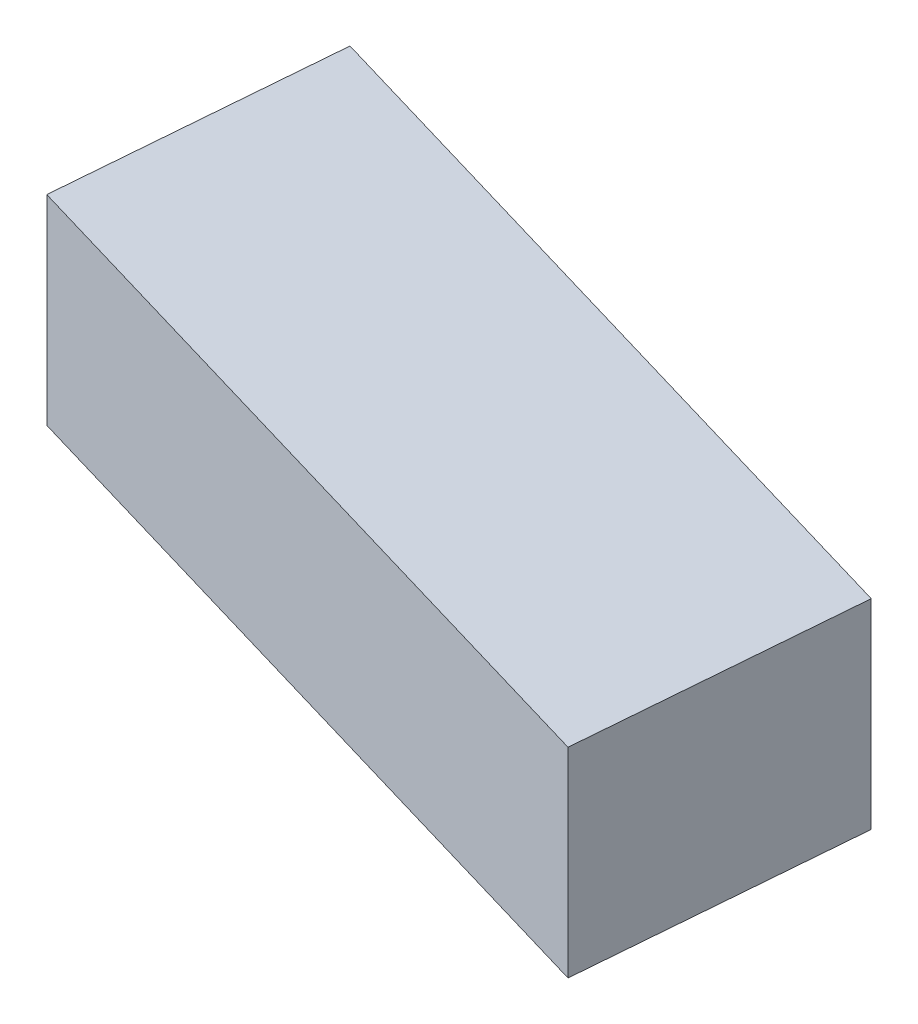
ISO-10303-21;
HEADER;
FILE_DESCRIPTION(('STEP AP214'),'2;1');
FILE_NAME('part.step','',(''),(''),'','','');
FILE_SCHEMA(('AUTOMOTIVE_DESIGN { 1 0 10303 214 1 1 1 1 }'));
ENDSEC;
DATA;
#1=APPLICATION_CONTEXT('core data for automotive mechanical design processes');
#2=APPLICATION_PROTOCOL_DEFINITION('international standard','automotive_design',2000,#1);
#3=PRODUCT_CONTEXT('',#1,'mechanical');
#4=PRODUCT('Part','Part','',(#3));
#5=PRODUCT_RELATED_PRODUCT_CATEGORY('part','',(#4));
#6=PRODUCT_DEFINITION_FORMATION('','',#4);
#7=PRODUCT_DEFINITION_CONTEXT('part definition',#1,'design');
#8=PRODUCT_DEFINITION('design','',#6,#7);
#9=PRODUCT_DEFINITION_SHAPE('','',#8);
#10=(LENGTH_UNIT() NAMED_UNIT(*) SI_UNIT(.MILLI.,.METRE.));
#11=(NAMED_UNIT(*) PLANE_ANGLE_UNIT() SI_UNIT($,.RADIAN.));
#12=(NAMED_UNIT(*) SI_UNIT($,.STERADIAN.) SOLID_ANGLE_UNIT());
#13=UNCERTAINTY_MEASURE_WITH_UNIT(LENGTH_MEASURE(1.E-05),#10,'distance_accuracy_value','');
#14=(GEOMETRIC_REPRESENTATION_CONTEXT(3) GLOBAL_UNCERTAINTY_ASSIGNED_CONTEXT((#13)) GLOBAL_UNIT_ASSIGNED_CONTEXT((#10,
#11,#12)) REPRESENTATION_CONTEXT('',''));
#15=CARTESIAN_POINT('',(0.,0.,0.));
#16=DIRECTION('',(0.,0.,1.));
#17=DIRECTION('',(1.,0.,0.));
#18=AXIS2_PLACEMENT_3D('',#15,#16,#17);
#19=CARTESIAN_POINT('',(-72.4120481748192,32.766,14.9143399504424));
#20=DIRECTION('',(0.282857104349254,0.,-0.959162060612885));
#21=DIRECTION('',(-0.959162060612885,0.,-0.282857104349254));
#22=AXIS2_PLACEMENT_3D('',#19,#20,#21);
#23=PLANE('',#22);
#24=DIRECTION('',(0.959162060612885,0.,0.282857104349254));
#25=VECTOR('',#24,1.);
#26=CARTESIAN_POINT('',(-72.4120481748192,0.,14.9143399504424));
#27=LINE('',#26,#25);
#28=CARTESIAN_POINT('',(-72.4120481748192,0.,14.9143399504424));
#29=VERTEX_POINT('',#28);
#30=CARTESIAN_POINT('',(48.7837593503978,0.,50.6550104623136));
#31=VERTEX_POINT('',#30);
#32=EDGE_CURVE('E105',#29,#31,#27,.T.);
#33=ORIENTED_EDGE('',*,*,#32,.T.);
#34=DIRECTION('',(0.,-1.,0.));
#35=VECTOR('',#34,1.);
#36=CARTESIAN_POINT('',(48.7837593503978,32.766,50.6550104623136));
#37=LINE('',#36,#35);
#38=CARTESIAN_POINT('',(48.7837593503978,32.766,50.6550104623136));
#39=VERTEX_POINT('',#38);
#40=EDGE_CURVE('E11',#39,#31,#37,.T.);
#41=ORIENTED_EDGE('',*,*,#40,.F.);
#42=DIRECTION('',(0.959162060612885,0.,0.282857104349254));
#43=VECTOR('',#42,1.);
#44=CARTESIAN_POINT('',(-72.4120481748192,32.766,14.9143399504424));
#45=LINE('',#44,#43);
#46=CARTESIAN_POINT('',(-72.4120481748192,32.766,14.9143399504424));
#47=VERTEX_POINT('',#46);
#48=EDGE_CURVE('E82',#47,#39,#45,.T.);
#49=ORIENTED_EDGE('',*,*,#48,.F.);
#50=DIRECTION('',(0.,-1.,0.));
#51=VECTOR('',#50,1.);
#52=CARTESIAN_POINT('',(-72.4120481748192,32.766,14.9143399504424));
#53=LINE('',#52,#51);
#54=EDGE_CURVE('E101',#47,#29,#53,.T.);
#55=ORIENTED_EDGE('',*,*,#54,.T.);
#56=EDGE_LOOP('',(#33,#41,#49,#55));
#57=FACE_BOUND('',#56,.T.);
#58=ADVANCED_FACE('F43',(#57),#23,.F.);
#59=CARTESIAN_POINT('',(52.5459351937527,32.766,4.70271980419357));
#60=DIRECTION('',(0.996665296280757,0.,0.0815983283504715));
#61=DIRECTION('',(0.0815983283504715,0.,-0.996665296280757));
#62=AXIS2_PLACEMENT_3D('',#59,#60,#61);
#63=PLANE('',#62);
#64=DIRECTION('',(-0.0815983283504715,0.,0.996665296280757));
#65=VECTOR('',#64,1.);
#66=CARTESIAN_POINT('',(52.5459351937527,0.,4.70271980419357));
#67=LINE('',#66,#65);
#68=CARTESIAN_POINT('',(52.5459351937527,0.,4.70271980419357));
#69=VERTEX_POINT('',#68);
#70=EDGE_CURVE('E91',#69,#31,#67,.T.);
#71=ORIENTED_EDGE('',*,*,#70,.F.);
#72=DIRECTION('',(0.,-1.,0.));
#73=VECTOR('',#72,1.);
#74=CARTESIAN_POINT('',(52.5459351937527,32.766,4.70271980419357));
#75=LINE('',#74,#73);
#76=CARTESIAN_POINT('',(52.5459351937527,32.766,4.70271980419357));
#77=VERTEX_POINT('',#76);
#78=EDGE_CURVE('E51',#77,#69,#75,.T.);
#79=ORIENTED_EDGE('',*,*,#78,.F.);
#80=DIRECTION('',(-0.0815983283504715,0.,0.996665296280757));
#81=VECTOR('',#80,1.);
#82=CARTESIAN_POINT('',(52.5459351937527,32.766,4.70271980419357));
#83=LINE('',#82,#81);
#84=EDGE_CURVE('E89',#77,#39,#83,.T.);
#85=ORIENTED_EDGE('',*,*,#84,.T.);
#86=ORIENTED_EDGE('',*,*,#40,.T.);
#87=EDGE_LOOP('',(#71,#79,#85,#86));
#88=FACE_BOUND('',#87,.T.);
#89=ADVANCED_FACE('F88',(#88),#63,.T.);
#90=CARTESIAN_POINT('',(-68.6498723314644,32.766,-31.0379507076776));
#91=DIRECTION('',(0.282857104349254,0.,-0.959162060612885));
#92=DIRECTION('',(-0.959162060612885,0.,-0.282857104349254));
#93=AXIS2_PLACEMENT_3D('',#90,#91,#92);
#94=PLANE('',#93);
#95=DIRECTION('',(0.959162060612885,0.,0.282857104349254));
#96=VECTOR('',#95,1.);
#97=CARTESIAN_POINT('',(-68.6498723314644,0.,-31.0379507076776));
#98=LINE('',#97,#96);
#99=CARTESIAN_POINT('',(-68.6498723314644,0.,-31.0379507076776));
#100=VERTEX_POINT('',#99);
#101=EDGE_CURVE('E109',#100,#69,#98,.T.);
#102=ORIENTED_EDGE('',*,*,#101,.F.);
#103=DIRECTION('',(0.,-1.,0.));
#104=VECTOR('',#103,1.);
#105=CARTESIAN_POINT('',(-68.6498723314644,32.766,-31.0379507076776));
#106=LINE('',#105,#104);
#107=CARTESIAN_POINT('',(-68.6498723314644,32.766,-31.0379507076776));
#108=VERTEX_POINT('',#107);
#109=EDGE_CURVE('E74',#108,#100,#106,.T.);
#110=ORIENTED_EDGE('',*,*,#109,.F.);
#111=DIRECTION('',(0.959162060612885,0.,0.282857104349254));
#112=VECTOR('',#111,1.);
#113=CARTESIAN_POINT('',(-68.6498723314644,32.766,-31.0379507076776));
#114=LINE('',#113,#112);
#115=EDGE_CURVE('E97',#108,#77,#114,.T.);
#116=ORIENTED_EDGE('',*,*,#115,.T.);
#117=ORIENTED_EDGE('',*,*,#78,.T.);
#118=EDGE_LOOP('',(#102,#110,#116,#117));
#119=FACE_BOUND('',#118,.T.);
#120=ADVANCED_FACE('F99',(#119),#94,.T.);
#121=CARTESIAN_POINT('',(-68.6498723314644,32.766,-31.0379507076776));
#122=DIRECTION('',(0.996665296280757,0.,0.0815983283504715));
#123=DIRECTION('',(0.0815983283504715,0.,-0.996665296280757));
#124=AXIS2_PLACEMENT_3D('',#121,#122,#123);
#125=PLANE('',#124);
#126=DIRECTION('',(-0.0815983283504715,0.,0.996665296280757));
#127=VECTOR('',#126,1.);
#128=CARTESIAN_POINT('',(-68.6498723314644,0.,-31.0379507076776));
#129=LINE('',#128,#127);
#130=EDGE_CURVE('E77',#100,#29,#129,.T.);
#131=ORIENTED_EDGE('',*,*,#130,.T.);
#132=ORIENTED_EDGE('',*,*,#54,.F.);
#133=DIRECTION('',(-0.0815983283504715,0.,0.996665296280757));
#134=VECTOR('',#133,1.);
#135=CARTESIAN_POINT('',(-68.6498723314644,32.766,-31.0379507076776));
#136=LINE('',#135,#134);
#137=EDGE_CURVE('E59',#108,#47,#136,.T.);
#138=ORIENTED_EDGE('',*,*,#137,.F.);
#139=ORIENTED_EDGE('',*,*,#109,.T.);
#140=EDGE_LOOP('',(#131,#132,#138,#139));
#141=FACE_BOUND('',#140,.T.);
#142=ADVANCED_FACE('F122',(#141),#125,.F.);
#143=CARTESIAN_POINT('',(0.,32.766,0.));
#144=DIRECTION('',(0.,-1.,0.));
#145=DIRECTION('',(0.,0.,-1.));
#146=AXIS2_PLACEMENT_3D('',#143,#144,#145);
#147=PLANE('',#146);
#148=ORIENTED_EDGE('',*,*,#48,.T.);
#149=ORIENTED_EDGE('',*,*,#84,.F.);
#150=ORIENTED_EDGE('',*,*,#115,.F.);
#151=ORIENTED_EDGE('',*,*,#137,.T.);
#152=EDGE_LOOP('',(#148,#149,#150,#151));
#153=FACE_BOUND('',#152,.T.);
#154=ADVANCED_FACE('F96',(#153),#147,.F.);
#155=CARTESIAN_POINT('',(0.,0.,0.));
#156=DIRECTION('',(0.,-1.,0.));
#157=DIRECTION('',(0.,0.,-1.));
#158=AXIS2_PLACEMENT_3D('',#155,#156,#157);
#159=PLANE('',#158);
#160=ORIENTED_EDGE('',*,*,#32,.F.);
#161=ORIENTED_EDGE('',*,*,#130,.F.);
#162=ORIENTED_EDGE('',*,*,#101,.T.);
#163=ORIENTED_EDGE('',*,*,#70,.T.);
#164=EDGE_LOOP('',(#160,#161,#162,#163));
#165=FACE_BOUND('',#164,.T.);
#166=ADVANCED_FACE('F116',(#165),#159,.T.);
#167=CLOSED_SHELL('',(#58,#89,#120,#142,#154,#166));
#168=MANIFOLD_SOLID_BREP('B2',#167);
#169=ADVANCED_BREP_SHAPE_REPRESENTATION('',(#18,#168),#14);
#170=SHAPE_DEFINITION_REPRESENTATION(#9,#169);
ENDSEC;
END-ISO-10303-21;
